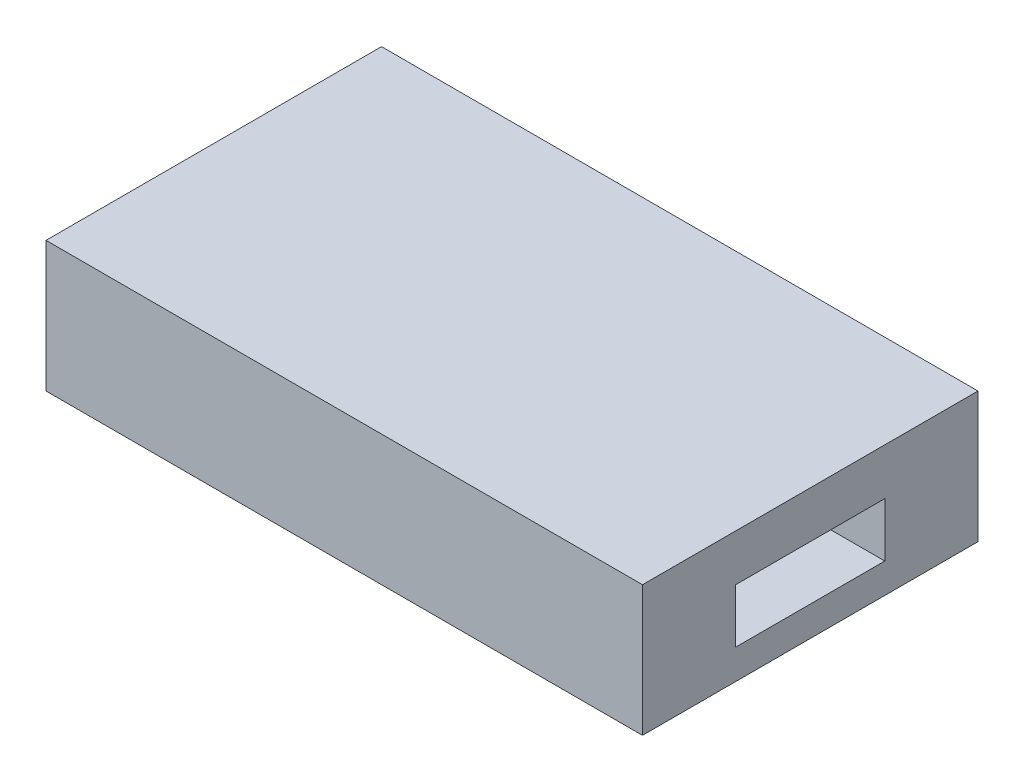
ISO-10303-21;
HEADER;
FILE_DESCRIPTION(('STEP AP214'),'2;1');
FILE_NAME('part.step','',(''),(''),'','','');
FILE_SCHEMA(('AUTOMOTIVE_DESIGN { 1 0 10303 214 1 1 1 1 }'));
ENDSEC;
DATA;
#1=APPLICATION_CONTEXT('core data for automotive mechanical design processes');
#2=APPLICATION_PROTOCOL_DEFINITION('international standard','automotive_design',2000,#1);
#3=PRODUCT_CONTEXT('',#1,'mechanical');
#4=PRODUCT('Part','Part','',(#3));
#5=PRODUCT_RELATED_PRODUCT_CATEGORY('part','',(#4));
#6=PRODUCT_DEFINITION_FORMATION('','',#4);
#7=PRODUCT_DEFINITION_CONTEXT('part definition',#1,'design');
#8=PRODUCT_DEFINITION('design','',#6,#7);
#9=PRODUCT_DEFINITION_SHAPE('','',#8);
#10=(LENGTH_UNIT() NAMED_UNIT(*) SI_UNIT(.MILLI.,.METRE.));
#11=(NAMED_UNIT(*) PLANE_ANGLE_UNIT() SI_UNIT($,.RADIAN.));
#12=(NAMED_UNIT(*) SI_UNIT($,.STERADIAN.) SOLID_ANGLE_UNIT());
#13=UNCERTAINTY_MEASURE_WITH_UNIT(LENGTH_MEASURE(1.E-05),#10,'distance_accuracy_value','');
#14=(GEOMETRIC_REPRESENTATION_CONTEXT(3) GLOBAL_UNCERTAINTY_ASSIGNED_CONTEXT((#13)) GLOBAL_UNIT_ASSIGNED_CONTEXT((#10,
#11,#12)) REPRESENTATION_CONTEXT('',''));
#15=CARTESIAN_POINT('',(0.,0.,0.));
#16=DIRECTION('',(0.,0.,1.));
#17=DIRECTION('',(1.,0.,0.));
#18=AXIS2_PLACEMENT_3D('',#15,#16,#17);
#19=CARTESIAN_POINT('',(0.,7.,0.));
#20=DIRECTION('',(1.,0.,0.));
#21=DIRECTION('',(0.,0.,-1.));
#22=AXIS2_PLACEMENT_3D('',#19,#20,#21);
#23=PLANE('',#22);
#24=DIRECTION('',(0.,0.,1.));
#25=VECTOR('',#24,1.);
#26=CARTESIAN_POINT('',(0.,0.,0.));
#27=LINE('',#26,#25);
#28=CARTESIAN_POINT('',(0.,0.,-18.));
#29=VERTEX_POINT('',#28);
#30=CARTESIAN_POINT('',(0.,0.,0.));
#31=VERTEX_POINT('',#30);
#32=EDGE_CURVE('E141',#29,#31,#27,.T.);
#33=ORIENTED_EDGE('',*,*,#32,.T.);
#34=DIRECTION('',(0.,-1.,0.));
#35=VECTOR('',#34,1.);
#36=CARTESIAN_POINT('',(0.,7.,0.));
#37=LINE('',#36,#35);
#38=CARTESIAN_POINT('',(0.,7.,0.));
#39=VERTEX_POINT('',#38);
#40=EDGE_CURVE('E11',#39,#31,#37,.T.);
#41=ORIENTED_EDGE('',*,*,#40,.F.);
#42=DIRECTION('',(0.,0.,1.));
#43=VECTOR('',#42,1.);
#44=CARTESIAN_POINT('',(0.,7.,0.));
#45=LINE('',#44,#43);
#46=CARTESIAN_POINT('',(0.,7.,-18.));
#47=VERTEX_POINT('',#46);
#48=EDGE_CURVE('E145',#47,#39,#45,.T.);
#49=ORIENTED_EDGE('',*,*,#48,.F.);
#50=DIRECTION('',(0.,-1.,0.));
#51=VECTOR('',#50,1.);
#52=CARTESIAN_POINT('',(0.,7.,-18.));
#53=LINE('',#52,#51);
#54=EDGE_CURVE('E151',#47,#29,#53,.T.);
#55=ORIENTED_EDGE('',*,*,#54,.T.);
#56=EDGE_LOOP('',(#33,#41,#49,#55));
#57=FACE_BOUND('',#56,.T.);
#58=ADVANCED_FACE('F33',(#57),#23,.F.);
#59=CARTESIAN_POINT('',(0.,7.,0.));
#60=DIRECTION('',(0.,0.,-1.));
#61=DIRECTION('',(-1.,0.,0.));
#62=AXIS2_PLACEMENT_3D('',#59,#60,#61);
#63=PLANE('',#62);
#64=DIRECTION('',(1.,0.,0.));
#65=VECTOR('',#64,1.);
#66=CARTESIAN_POINT('',(0.,0.,0.));
#67=LINE('',#66,#65);
#68=CARTESIAN_POINT('',(32.,0.,0.));
#69=VERTEX_POINT('',#68);
#70=EDGE_CURVE('E154',#31,#69,#67,.T.);
#71=ORIENTED_EDGE('',*,*,#70,.T.);
#72=DIRECTION('',(0.,-1.,0.));
#73=VECTOR('',#72,1.);
#74=CARTESIAN_POINT('',(32.,7.,0.));
#75=LINE('',#74,#73);
#76=CARTESIAN_POINT('',(32.,7.,0.));
#77=VERTEX_POINT('',#76);
#78=EDGE_CURVE('E40',#77,#69,#75,.T.);
#79=ORIENTED_EDGE('',*,*,#78,.F.);
#80=DIRECTION('',(1.,0.,0.));
#81=VECTOR('',#80,1.);
#82=CARTESIAN_POINT('',(0.,7.,0.));
#83=LINE('',#82,#81);
#84=EDGE_CURVE('E84',#39,#77,#83,.T.);
#85=ORIENTED_EDGE('',*,*,#84,.F.);
#86=ORIENTED_EDGE('',*,*,#40,.T.);
#87=EDGE_LOOP('',(#71,#79,#85,#86));
#88=FACE_BOUND('',#87,.T.);
#89=ADVANCED_FACE('F182',(#88),#63,.F.);
#90=CARTESIAN_POINT('',(32.,7.,0.));
#91=DIRECTION('',(-1.,0.,0.));
#92=DIRECTION('',(0.,0.,1.));
#93=AXIS2_PLACEMENT_3D('',#90,#91,#92);
#94=PLANE('',#93);
#95=DIRECTION('',(0.,0.,-1.));
#96=VECTOR('',#95,1.);
#97=CARTESIAN_POINT('',(32.,1.6,-5.));
#98=LINE('',#97,#96);
#99=CARTESIAN_POINT('',(32.,1.6,-5.));
#100=VERTEX_POINT('',#99);
#101=CARTESIAN_POINT('',(32.,1.6,-13.));
#102=VERTEX_POINT('',#101);
#103=EDGE_CURVE('E135',#100,#102,#98,.T.);
#104=ORIENTED_EDGE('',*,*,#103,.F.);
#105=DIRECTION('',(0.,-1.,0.));
#106=VECTOR('',#105,1.);
#107=CARTESIAN_POINT('',(32.,1.6,-5.));
#108=LINE('',#107,#106);
#109=CARTESIAN_POINT('',(32.,4.5,-5.));
#110=VERTEX_POINT('',#109);
#111=EDGE_CURVE('E47',#110,#100,#108,.T.);
#112=ORIENTED_EDGE('',*,*,#111,.F.);
#113=DIRECTION('',(0.,0.,1.));
#114=VECTOR('',#113,1.);
#115=CARTESIAN_POINT('',(32.,4.5,-5.));
#116=LINE('',#115,#114);
#117=CARTESIAN_POINT('',(32.,4.5,-13.));
#118=VERTEX_POINT('',#117);
#119=EDGE_CURVE('E126',#118,#110,#116,.T.);
#120=ORIENTED_EDGE('',*,*,#119,.F.);
#121=DIRECTION('',(0.,1.,0.));
#122=VECTOR('',#121,1.);
#123=CARTESIAN_POINT('',(32.,1.6,-13.));
#124=LINE('',#123,#122);
#125=EDGE_CURVE('E129',#102,#118,#124,.T.);
#126=ORIENTED_EDGE('',*,*,#125,.F.);
#127=EDGE_LOOP('',(#104,#112,#120,#126));
#128=FACE_BOUND('',#127,.T.);
#129=DIRECTION('',(0.,0.,-1.));
#130=VECTOR('',#129,1.);
#131=CARTESIAN_POINT('',(32.,0.,0.));
#132=LINE('',#131,#130);
#133=CARTESIAN_POINT('',(32.,0.,-18.));
#134=VERTEX_POINT('',#133);
#135=EDGE_CURVE('E156',#69,#134,#132,.T.);
#136=ORIENTED_EDGE('',*,*,#135,.T.);
#137=DIRECTION('',(0.,-1.,0.));
#138=VECTOR('',#137,1.);
#139=CARTESIAN_POINT('',(32.,7.,-18.));
#140=LINE('',#139,#138);
#141=CARTESIAN_POINT('',(32.,7.,-18.));
#142=VERTEX_POINT('',#141);
#143=EDGE_CURVE('E160',#142,#134,#140,.T.);
#144=ORIENTED_EDGE('',*,*,#143,.F.);
#145=DIRECTION('',(0.,0.,-1.));
#146=VECTOR('',#145,1.);
#147=CARTESIAN_POINT('',(32.,7.,0.));
#148=LINE('',#147,#146);
#149=EDGE_CURVE('E148',#77,#142,#148,.T.);
#150=ORIENTED_EDGE('',*,*,#149,.F.);
#151=ORIENTED_EDGE('',*,*,#78,.T.);
#152=EDGE_LOOP('',(#136,#144,#150,#151));
#153=FACE_BOUND('',#152,.T.);
#154=ADVANCED_FACE('F165',(#128,#153),#94,.F.);
#155=CARTESIAN_POINT('',(0.,7.,-18.));
#156=DIRECTION('',(0.,0.,1.));
#157=DIRECTION('',(1.,0.,0.));
#158=AXIS2_PLACEMENT_3D('',#155,#156,#157);
#159=PLANE('',#158);
#160=DIRECTION('',(-1.,0.,0.));
#161=VECTOR('',#160,1.);
#162=CARTESIAN_POINT('',(0.,0.,-18.));
#163=LINE('',#162,#161);
#164=EDGE_CURVE('E77',#134,#29,#163,.T.);
#165=ORIENTED_EDGE('',*,*,#164,.T.);
#166=ORIENTED_EDGE('',*,*,#54,.F.);
#167=DIRECTION('',(-1.,0.,0.));
#168=VECTOR('',#167,1.);
#169=CARTESIAN_POINT('',(0.,7.,-18.));
#170=LINE('',#169,#168);
#171=EDGE_CURVE('E56',#142,#47,#170,.T.);
#172=ORIENTED_EDGE('',*,*,#171,.F.);
#173=ORIENTED_EDGE('',*,*,#143,.T.);
#174=EDGE_LOOP('',(#165,#166,#172,#173));
#175=FACE_BOUND('',#174,.T.);
#176=ADVANCED_FACE('F173',(#175),#159,.F.);
#177=CARTESIAN_POINT('',(0.,7.,0.));
#178=DIRECTION('',(0.,-1.,0.));
#179=DIRECTION('',(0.,0.,-1.));
#180=AXIS2_PLACEMENT_3D('',#177,#178,#179);
#181=PLANE('',#180);
#182=ORIENTED_EDGE('',*,*,#48,.T.);
#183=ORIENTED_EDGE('',*,*,#84,.T.);
#184=ORIENTED_EDGE('',*,*,#149,.T.);
#185=ORIENTED_EDGE('',*,*,#171,.T.);
#186=EDGE_LOOP('',(#182,#183,#184,#185));
#187=FACE_BOUND('',#186,.T.);
#188=ADVANCED_FACE('F175',(#187),#181,.F.);
#189=CARTESIAN_POINT('',(0.,0.,0.));
#190=DIRECTION('',(0.,-1.,0.));
#191=DIRECTION('',(0.,0.,-1.));
#192=AXIS2_PLACEMENT_3D('',#189,#190,#191);
#193=PLANE('',#192);
#194=ORIENTED_EDGE('',*,*,#32,.F.);
#195=ORIENTED_EDGE('',*,*,#164,.F.);
#196=ORIENTED_EDGE('',*,*,#135,.F.);
#197=ORIENTED_EDGE('',*,*,#70,.F.);
#198=EDGE_LOOP('',(#194,#195,#196,#197));
#199=FACE_BOUND('',#198,.T.);
#200=ADVANCED_FACE('F169',(#199),#193,.T.);
#201=CARTESIAN_POINT('',(27.,1.6,-5.));
#202=DIRECTION('',(0.,0.,1.));
#203=DIRECTION('',(1.,0.,0.));
#204=AXIS2_PLACEMENT_3D('',#201,#202,#203);
#205=PLANE('',#204);
#206=ORIENTED_EDGE('',*,*,#111,.T.);
#207=DIRECTION('',(1.,0.,0.));
#208=VECTOR('',#207,1.);
#209=CARTESIAN_POINT('',(27.,1.6,-5.));
#210=LINE('',#209,#208);
#211=CARTESIAN_POINT('',(27.,1.6,-5.));
#212=VERTEX_POINT('',#211);
#213=EDGE_CURVE('E104',#212,#100,#210,.T.);
#214=ORIENTED_EDGE('',*,*,#213,.F.);
#215=DIRECTION('',(0.,-1.,0.));
#216=VECTOR('',#215,1.);
#217=CARTESIAN_POINT('',(27.,1.6,-5.));
#218=LINE('',#217,#216);
#219=CARTESIAN_POINT('',(27.,4.5,-5.));
#220=VERTEX_POINT('',#219);
#221=EDGE_CURVE('E108',#220,#212,#218,.T.);
#222=ORIENTED_EDGE('',*,*,#221,.F.);
#223=DIRECTION('',(1.,0.,0.));
#224=VECTOR('',#223,1.);
#225=CARTESIAN_POINT('',(27.,4.5,-5.));
#226=LINE('',#225,#224);
#227=EDGE_CURVE('E139',#220,#110,#226,.T.);
#228=ORIENTED_EDGE('',*,*,#227,.T.);
#229=EDGE_LOOP('',(#206,#214,#222,#228));
#230=FACE_BOUND('',#229,.T.);
#231=ADVANCED_FACE('F106',(#230),#205,.F.);
#232=CARTESIAN_POINT('',(27.,4.5,-5.));
#233=DIRECTION('',(0.,1.,0.));
#234=DIRECTION('',(0.,0.,1.));
#235=AXIS2_PLACEMENT_3D('',#232,#233,#234);
#236=PLANE('',#235);
#237=ORIENTED_EDGE('',*,*,#119,.T.);
#238=ORIENTED_EDGE('',*,*,#227,.F.);
#239=DIRECTION('',(0.,0.,1.));
#240=VECTOR('',#239,1.);
#241=CARTESIAN_POINT('',(27.,4.5,-5.));
#242=LINE('',#241,#240);
#243=CARTESIAN_POINT('',(27.,4.5,-13.));
#244=VERTEX_POINT('',#243);
#245=EDGE_CURVE('E114',#244,#220,#242,.T.);
#246=ORIENTED_EDGE('',*,*,#245,.F.);
#247=DIRECTION('',(1.,0.,0.));
#248=VECTOR('',#247,1.);
#249=CARTESIAN_POINT('',(27.,4.5,-13.));
#250=LINE('',#249,#248);
#251=EDGE_CURVE('E142',#244,#118,#250,.T.);
#252=ORIENTED_EDGE('',*,*,#251,.T.);
#253=EDGE_LOOP('',(#237,#238,#246,#252));
#254=FACE_BOUND('',#253,.T.);
#255=ADVANCED_FACE('F211',(#254),#236,.F.);
#256=CARTESIAN_POINT('',(27.,1.6,-13.));
#257=DIRECTION('',(0.,0.,-1.));
#258=DIRECTION('',(-1.,0.,0.));
#259=AXIS2_PLACEMENT_3D('',#256,#257,#258);
#260=PLANE('',#259);
#261=ORIENTED_EDGE('',*,*,#125,.T.);
#262=ORIENTED_EDGE('',*,*,#251,.F.);
#263=DIRECTION('',(0.,1.,0.));
#264=VECTOR('',#263,1.);
#265=CARTESIAN_POINT('',(27.,1.6,-13.));
#266=LINE('',#265,#264);
#267=CARTESIAN_POINT('',(27.,1.6,-13.));
#268=VERTEX_POINT('',#267);
#269=EDGE_CURVE('E122',#268,#244,#266,.T.);
#270=ORIENTED_EDGE('',*,*,#269,.F.);
#271=DIRECTION('',(1.,0.,0.));
#272=VECTOR('',#271,1.);
#273=CARTESIAN_POINT('',(27.,1.6,-13.));
#274=LINE('',#273,#272);
#275=EDGE_CURVE('E113',#268,#102,#274,.T.);
#276=ORIENTED_EDGE('',*,*,#275,.T.);
#277=EDGE_LOOP('',(#261,#262,#270,#276));
#278=FACE_BOUND('',#277,.T.);
#279=ADVANCED_FACE('F220',(#278),#260,.F.);
#280=CARTESIAN_POINT('',(27.,1.6,-5.));
#281=DIRECTION('',(0.,-1.,0.));
#282=DIRECTION('',(0.,0.,-1.));
#283=AXIS2_PLACEMENT_3D('',#280,#281,#282);
#284=PLANE('',#283);
#285=ORIENTED_EDGE('',*,*,#103,.T.);
#286=ORIENTED_EDGE('',*,*,#275,.F.);
#287=DIRECTION('',(0.,0.,-1.));
#288=VECTOR('',#287,1.);
#289=CARTESIAN_POINT('',(27.,1.6,-5.));
#290=LINE('',#289,#288);
#291=EDGE_CURVE('E117',#212,#268,#290,.T.);
#292=ORIENTED_EDGE('',*,*,#291,.F.);
#293=ORIENTED_EDGE('',*,*,#213,.T.);
#294=EDGE_LOOP('',(#285,#286,#292,#293));
#295=FACE_BOUND('',#294,.T.);
#296=ADVANCED_FACE('F118',(#295),#284,.F.);
#297=CARTESIAN_POINT('',(27.,0.,0.));
#298=DIRECTION('',(-1.,0.,0.));
#299=DIRECTION('',(0.,0.,1.));
#300=AXIS2_PLACEMENT_3D('',#297,#298,#299);
#301=PLANE('',#300);
#302=ORIENTED_EDGE('',*,*,#221,.T.);
#303=ORIENTED_EDGE('',*,*,#291,.T.);
#304=ORIENTED_EDGE('',*,*,#269,.T.);
#305=ORIENTED_EDGE('',*,*,#245,.T.);
#306=EDGE_LOOP('',(#302,#303,#304,#305));
#307=FACE_BOUND('',#306,.T.);
#308=ADVANCED_FACE('F124',(#307),#301,.F.);
#309=CLOSED_SHELL('',(#58,#89,#154,#176,#188,#200,#231,#255,#279,#296,#308));
#310=MANIFOLD_SOLID_BREP('B2',#309);
#311=ADVANCED_BREP_SHAPE_REPRESENTATION('',(#18,#310),#14);
#312=SHAPE_DEFINITION_REPRESENTATION(#9,#311);
ENDSEC;
END-ISO-10303-21;
